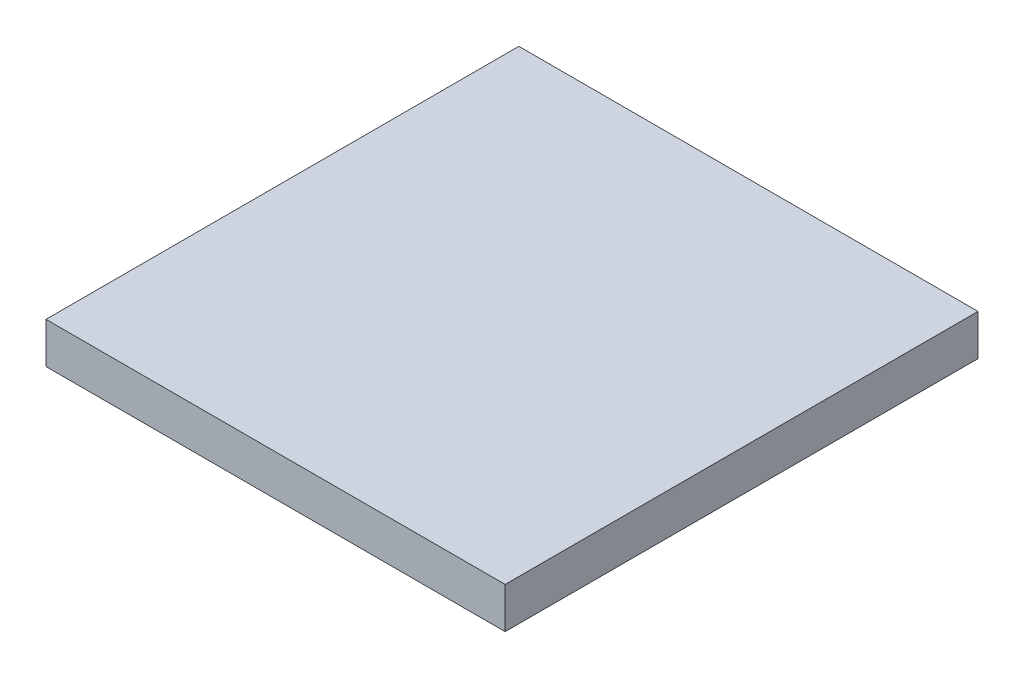
ISO-10303-21;
HEADER;
FILE_DESCRIPTION(('STEP AP214'),'2;1');
FILE_NAME('part.step','',(''),(''),'','','');
FILE_SCHEMA(('AUTOMOTIVE_DESIGN { 1 0 10303 214 1 1 1 1 }'));
ENDSEC;
DATA;
#1=APPLICATION_CONTEXT('core data for automotive mechanical design processes');
#2=APPLICATION_PROTOCOL_DEFINITION('international standard','automotive_design',2000,#1);
#3=PRODUCT_CONTEXT('',#1,'mechanical');
#4=PRODUCT('Part','Part','',(#3));
#5=PRODUCT_RELATED_PRODUCT_CATEGORY('part','',(#4));
#6=PRODUCT_DEFINITION_FORMATION('','',#4);
#7=PRODUCT_DEFINITION_CONTEXT('part definition',#1,'design');
#8=PRODUCT_DEFINITION('design','',#6,#7);
#9=PRODUCT_DEFINITION_SHAPE('','',#8);
#10=(LENGTH_UNIT() NAMED_UNIT(*) SI_UNIT(.MILLI.,.METRE.));
#11=(NAMED_UNIT(*) PLANE_ANGLE_UNIT() SI_UNIT($,.RADIAN.));
#12=(NAMED_UNIT(*) SI_UNIT($,.STERADIAN.) SOLID_ANGLE_UNIT());
#13=UNCERTAINTY_MEASURE_WITH_UNIT(LENGTH_MEASURE(1.E-05),#10,'distance_accuracy_value','');
#14=(GEOMETRIC_REPRESENTATION_CONTEXT(3) GLOBAL_UNCERTAINTY_ASSIGNED_CONTEXT((#13)) GLOBAL_UNIT_ASSIGNED_CONTEXT((#10,
#11,#12)) REPRESENTATION_CONTEXT('',''));
#15=CARTESIAN_POINT('',(0.,0.,0.));
#16=DIRECTION('',(0.,0.,1.));
#17=DIRECTION('',(1.,0.,0.));
#18=AXIS2_PLACEMENT_3D('',#15,#16,#17);
#19=CARTESIAN_POINT('',(-44.9419919687216,7.62,-44.2127101517849));
#20=DIRECTION('',(0.,0.,-1.));
#21=DIRECTION('',(-1.,0.,0.));
#22=AXIS2_PLACEMENT_3D('',#19,#20,#21);
#23=PLANE('',#22);
#24=DIRECTION('',(1.,0.,0.));
#25=VECTOR('',#24,1.);
#26=CARTESIAN_POINT('',(-44.9419919687216,0.,-44.2127101517849));
#27=LINE('',#26,#25);
#28=CARTESIAN_POINT('',(-44.9419919687216,0.,-44.2127101517849));
#29=VERTEX_POINT('',#28);
#30=CARTESIAN_POINT('',(40.5663010671017,0.,-44.2127101517849));
#31=VERTEX_POINT('',#30);
#32=EDGE_CURVE('E110',#29,#31,#27,.T.);
#33=ORIENTED_EDGE('',*,*,#32,.F.);
#34=DIRECTION('',(0.,-1.,0.));
#35=VECTOR('',#34,1.);
#36=CARTESIAN_POINT('',(-44.9419919687216,7.62,-44.2127101517849));
#37=LINE('',#36,#35);
#38=CARTESIAN_POINT('',(-44.9419919687216,7.62,-44.2127101517849));
#39=VERTEX_POINT('',#38);
#40=EDGE_CURVE('E11',#39,#29,#37,.T.);
#41=ORIENTED_EDGE('',*,*,#40,.F.);
#42=DIRECTION('',(1.,0.,0.));
#43=VECTOR('',#42,1.);
#44=CARTESIAN_POINT('',(-44.9419919687216,7.62,-44.2127101517849));
#45=LINE('',#44,#43);
#46=CARTESIAN_POINT('',(40.5663010671017,7.62,-44.2127101517849));
#47=VERTEX_POINT('',#46);
#48=EDGE_CURVE('E103',#39,#47,#45,.T.);
#49=ORIENTED_EDGE('',*,*,#48,.T.);
#50=DIRECTION('',(0.,-1.,0.));
#51=VECTOR('',#50,1.);
#52=CARTESIAN_POINT('',(40.5663010671017,7.62,-44.2127101517849));
#53=LINE('',#52,#51);
#54=EDGE_CURVE('E48',#47,#31,#53,.T.);
#55=ORIENTED_EDGE('',*,*,#54,.T.);
#56=EDGE_LOOP('',(#33,#41,#49,#55));
#57=FACE_BOUND('',#56,.T.);
#58=ADVANCED_FACE('F44',(#57),#23,.T.);
#59=CARTESIAN_POINT('',(-44.9419919687216,7.62,-44.2127101517849));
#60=DIRECTION('',(1.,0.,0.));
#61=DIRECTION('',(0.,0.,-1.));
#62=AXIS2_PLACEMENT_3D('',#59,#60,#61);
#63=PLANE('',#62);
#64=DIRECTION('',(0.,0.,1.));
#65=VECTOR('',#64,1.);
#66=CARTESIAN_POINT('',(-44.9419919687216,0.,-44.2127101517849));
#67=LINE('',#66,#65);
#68=CARTESIAN_POINT('',(-44.9419919687216,0.,43.8480692433166));
#69=VERTEX_POINT('',#68);
#70=EDGE_CURVE('E76',#29,#69,#67,.T.);
#71=ORIENTED_EDGE('',*,*,#70,.T.);
#72=DIRECTION('',(0.,-1.,0.));
#73=VECTOR('',#72,1.);
#74=CARTESIAN_POINT('',(-44.9419919687216,7.62,43.8480692433166));
#75=LINE('',#74,#73);
#76=CARTESIAN_POINT('',(-44.9419919687216,7.62,43.8480692433166));
#77=VERTEX_POINT('',#76);
#78=EDGE_CURVE('E53',#77,#69,#75,.T.);
#79=ORIENTED_EDGE('',*,*,#78,.F.);
#80=DIRECTION('',(0.,0.,1.));
#81=VECTOR('',#80,1.);
#82=CARTESIAN_POINT('',(-44.9419919687216,7.62,-44.2127101517849));
#83=LINE('',#82,#81);
#84=EDGE_CURVE('E94',#39,#77,#83,.T.);
#85=ORIENTED_EDGE('',*,*,#84,.F.);
#86=ORIENTED_EDGE('',*,*,#40,.T.);
#87=EDGE_LOOP('',(#71,#79,#85,#86));
#88=FACE_BOUND('',#87,.T.);
#89=ADVANCED_FACE('F120',(#88),#63,.F.);
#90=CARTESIAN_POINT('',(-44.9419919687216,7.62,43.8480692433166));
#91=DIRECTION('',(0.,0.,-1.));
#92=DIRECTION('',(-1.,0.,0.));
#93=AXIS2_PLACEMENT_3D('',#90,#91,#92);
#94=PLANE('',#93);
#95=DIRECTION('',(1.,0.,0.));
#96=VECTOR('',#95,1.);
#97=CARTESIAN_POINT('',(-44.9419919687216,0.,43.8480692433166));
#98=LINE('',#97,#96);
#99=CARTESIAN_POINT('',(40.5663010671017,0.,43.8480692433166));
#100=VERTEX_POINT('',#99);
#101=EDGE_CURVE('E105',#69,#100,#98,.T.);
#102=ORIENTED_EDGE('',*,*,#101,.T.);
#103=DIRECTION('',(0.,-1.,0.));
#104=VECTOR('',#103,1.);
#105=CARTESIAN_POINT('',(40.5663010671017,7.62,43.8480692433166));
#106=LINE('',#105,#104);
#107=CARTESIAN_POINT('',(40.5663010671017,7.62,43.8480692433166));
#108=VERTEX_POINT('',#107);
#109=EDGE_CURVE('E98',#108,#100,#106,.T.);
#110=ORIENTED_EDGE('',*,*,#109,.F.);
#111=DIRECTION('',(1.,0.,0.));
#112=VECTOR('',#111,1.);
#113=CARTESIAN_POINT('',(-44.9419919687216,7.62,43.8480692433166));
#114=LINE('',#113,#112);
#115=EDGE_CURVE('E89',#77,#108,#114,.T.);
#116=ORIENTED_EDGE('',*,*,#115,.F.);
#117=ORIENTED_EDGE('',*,*,#78,.T.);
#118=EDGE_LOOP('',(#102,#110,#116,#117));
#119=FACE_BOUND('',#118,.T.);
#120=ADVANCED_FACE('F99',(#119),#94,.F.);
#121=CARTESIAN_POINT('',(40.5663010671017,7.62,-44.2127101517849));
#122=DIRECTION('',(1.,0.,0.));
#123=DIRECTION('',(0.,0.,-1.));
#124=AXIS2_PLACEMENT_3D('',#121,#122,#123);
#125=PLANE('',#124);
#126=DIRECTION('',(0.,0.,1.));
#127=VECTOR('',#126,1.);
#128=CARTESIAN_POINT('',(40.5663010671017,0.,-44.2127101517849));
#129=LINE('',#128,#127);
#130=EDGE_CURVE('E111',#31,#100,#129,.T.);
#131=ORIENTED_EDGE('',*,*,#130,.F.);
#132=ORIENTED_EDGE('',*,*,#54,.F.);
#133=DIRECTION('',(0.,0.,1.));
#134=VECTOR('',#133,1.);
#135=CARTESIAN_POINT('',(40.5663010671017,7.62,-44.2127101517849));
#136=LINE('',#135,#134);
#137=EDGE_CURVE('E92',#47,#108,#136,.T.);
#138=ORIENTED_EDGE('',*,*,#137,.T.);
#139=ORIENTED_EDGE('',*,*,#109,.T.);
#140=EDGE_LOOP('',(#131,#132,#138,#139));
#141=FACE_BOUND('',#140,.T.);
#142=ADVANCED_FACE('F101',(#141),#125,.T.);
#143=CARTESIAN_POINT('',(0.,7.62,0.));
#144=DIRECTION('',(0.,-1.,0.));
#145=DIRECTION('',(0.,0.,-1.));
#146=AXIS2_PLACEMENT_3D('',#143,#144,#145);
#147=PLANE('',#146);
#148=ORIENTED_EDGE('',*,*,#48,.F.);
#149=ORIENTED_EDGE('',*,*,#84,.T.);
#150=ORIENTED_EDGE('',*,*,#115,.T.);
#151=ORIENTED_EDGE('',*,*,#137,.F.);
#152=EDGE_LOOP('',(#148,#149,#150,#151));
#153=FACE_BOUND('',#152,.T.);
#154=ADVANCED_FACE('F93',(#153),#147,.F.);
#155=CARTESIAN_POINT('',(0.,0.,0.));
#156=DIRECTION('',(0.,-1.,0.));
#157=DIRECTION('',(0.,0.,-1.));
#158=AXIS2_PLACEMENT_3D('',#155,#156,#157);
#159=PLANE('',#158);
#160=ORIENTED_EDGE('',*,*,#32,.T.);
#161=ORIENTED_EDGE('',*,*,#130,.T.);
#162=ORIENTED_EDGE('',*,*,#101,.F.);
#163=ORIENTED_EDGE('',*,*,#70,.F.);
#164=EDGE_LOOP('',(#160,#161,#162,#163));
#165=FACE_BOUND('',#164,.T.);
#166=ADVANCED_FACE('F119',(#165),#159,.T.);
#167=CLOSED_SHELL('',(#58,#89,#120,#142,#154,#166));
#168=MANIFOLD_SOLID_BREP('B2',#167);
#169=ADVANCED_BREP_SHAPE_REPRESENTATION('',(#18,#168),#14);
#170=SHAPE_DEFINITION_REPRESENTATION(#9,#169);
ENDSEC;
END-ISO-10303-21;
